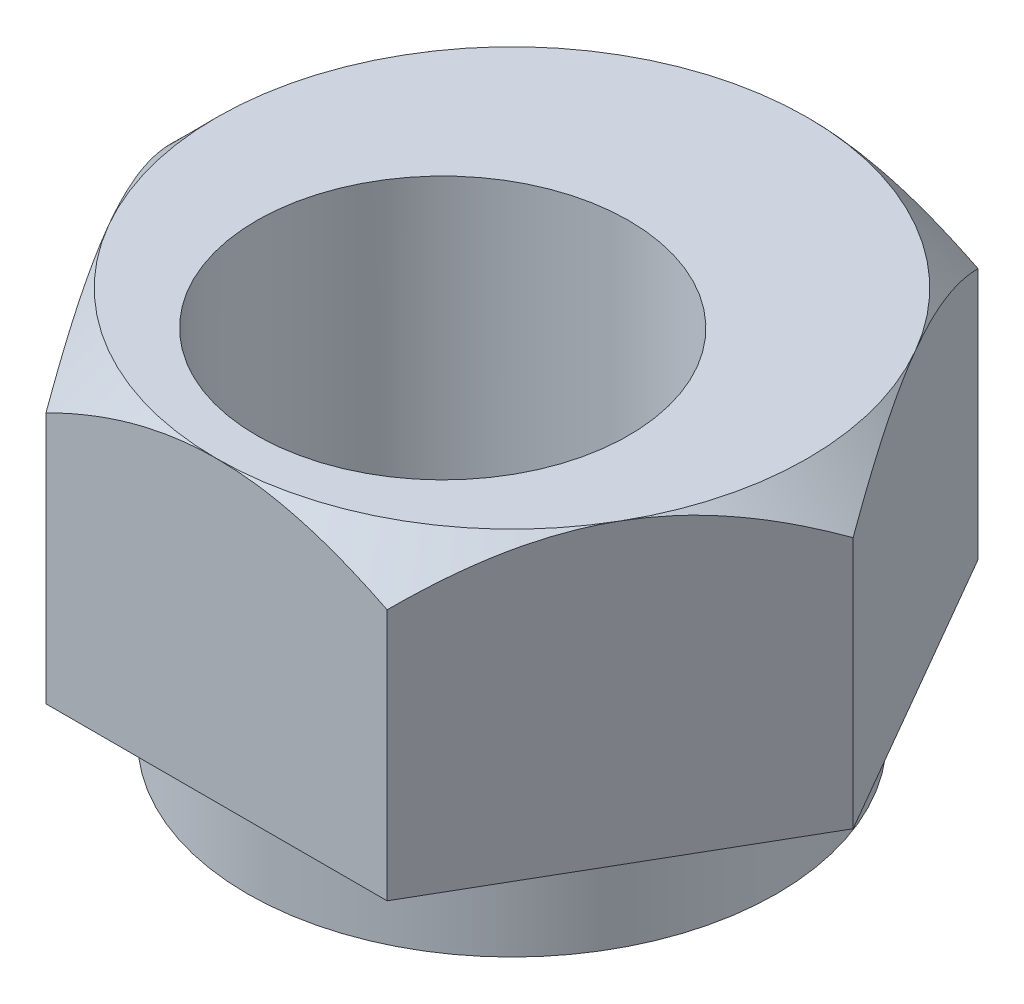
ISO-10303-21;
HEADER;
FILE_DESCRIPTION(('STEP AP214'),'2;1');
FILE_NAME('part.step','',(''),(''),'','','');
FILE_SCHEMA(('AUTOMOTIVE_DESIGN { 1 0 10303 214 1 1 1 1 }'));
ENDSEC;
DATA;
#1=APPLICATION_CONTEXT('core data for automotive mechanical design processes');
#2=APPLICATION_PROTOCOL_DEFINITION('international standard','automotive_design',2000,#1);
#3=PRODUCT_CONTEXT('',#1,'mechanical');
#4=PRODUCT('Part','Part','',(#3));
#5=PRODUCT_RELATED_PRODUCT_CATEGORY('part','',(#4));
#6=PRODUCT_DEFINITION_FORMATION('','',#4);
#7=PRODUCT_DEFINITION_CONTEXT('part definition',#1,'design');
#8=PRODUCT_DEFINITION('design','',#6,#7);
#9=PRODUCT_DEFINITION_SHAPE('','',#8);
#10=(LENGTH_UNIT() NAMED_UNIT(*) SI_UNIT(.MILLI.,.METRE.));
#11=(NAMED_UNIT(*) PLANE_ANGLE_UNIT() SI_UNIT($,.RADIAN.));
#12=(NAMED_UNIT(*) SI_UNIT($,.STERADIAN.) SOLID_ANGLE_UNIT());
#13=UNCERTAINTY_MEASURE_WITH_UNIT(LENGTH_MEASURE(1.E-05),#10,'distance_accuracy_value','');
#14=(GEOMETRIC_REPRESENTATION_CONTEXT(3) GLOBAL_UNCERTAINTY_ASSIGNED_CONTEXT((#13)) GLOBAL_UNIT_ASSIGNED_CONTEXT((#10,
#11,#12)) REPRESENTATION_CONTEXT('',''));
#15=CARTESIAN_POINT('',(0.,0.,0.));
#16=DIRECTION('',(0.,0.,1.));
#17=DIRECTION('',(1.,0.,0.));
#18=AXIS2_PLACEMENT_3D('',#15,#16,#17);
#19=CARTESIAN_POINT('',(0.,3.999999999999,0.));
#20=DIRECTION('',(0.,1.,0.));
#21=DIRECTION('',(0.,0.,1.));
#22=AXIS2_PLACEMENT_3D('',#19,#20,#21);
#23=PLANE('',#22);
#24=CARTESIAN_POINT('',(1.166697489341,3.999999999999,2.539836185835));
#25=CARTESIAN_POINT('',(0.883257962455717,3.999999999999,2.77528744265303));
#26=CARTESIAN_POINT('',(0.533594005447036,3.999999999999,2.902538680086));
#27=CARTESIAN_POINT('',(0.188940030478766,3.999999999999,3.02796666293016));
#28=CARTESIAN_POINT('',(-0.182778207629667,3.999999999999,3.03416217031467));
#29=CARTESIAN_POINT('',(-0.605155037690562,3.999999999999,3.04120201528704));
#30=CARTESIAN_POINT('',(-1.00776253572052,3.999999999999,2.89290446902202));
#31=CARTESIAN_POINT('',(-1.44869321008123,3.999999999999,2.7304908592392));
#32=CARTESIAN_POINT('',(-1.79750508633833,3.999999999999,2.40662784371367));
#33=CARTESIAN_POINT('',(-2.14544434499793,3.999999999999,2.08357503158361));
#34=CARTESIAN_POINT('',(-2.34904602147654,3.999999999999,1.64752654861127));
#35=CARTESIAN_POINT('',(-2.55612773403344,3.999999999999,1.20402496172117));
#36=CARTESIAN_POINT('',(-2.58214130883733,3.999999999999,0.7093389879597));
#37=CARTESIAN_POINT('',(-2.60843531854522,3.999999999999,0.209320136475604));
#38=CARTESIAN_POINT('',(-2.4451812772816,3.999999999999,-0.270702997808114));
#39=CARTESIAN_POINT('',(-2.28034954976724,3.999999999999,-0.75536507329745));
#40=CARTESIAN_POINT('',(-1.944203567264,3.999999999999,-1.150453567264));
#41=B_SPLINE_CURVE_WITH_KNOTS('',2,(#24,#25,#26,#27,#28,#29,#30,#31,#32,#33,#34,#35,#36,#37,#38,
#39,#40),.UNSPECIFIED.,.F.,.F.,(3,2,2,2,2,2,2,2,3),(0.,0.125,0.25,0.375,0.5,0.625,0.75,0.875,
1.),.UNSPECIFIED.);
#42=CARTESIAN_POINT('',(-2.46330983698216,4.00000005928982,1.35760135508939));
#43=VERTEX_POINT('',#42);
#44=CARTESIAN_POINT('',(-2.46395330810029,4.00001258649946,1.35447367589018));
#45=VERTEX_POINT('',#44);
#46=EDGE_CURVE('E13',#43,#45,#41,.T.);
#47=ORIENTED_EDGE('',*,*,#46,.T.);
#48=CARTESIAN_POINT('',(0.,3.999999999999,0.930865744066416));
#49=DIRECTION('',(0.,1.,0.));
#50=DIRECTION('',(0.,0.,1.));
#51=AXIS2_PLACEMENT_3D('',#48,#49,#50);
#52=CIRCLE('',#51,2.5);
#53=EDGE_CURVE('E133',#45,#43,#52,.F.);
#54=ORIENTED_EDGE('',*,*,#53,.T.);
#55=EDGE_LOOP('',(#47,#54));
#56=FACE_BOUND('',#55,.T.);
#57=CARTESIAN_POINT('',(0.,3.99999999996226,0.));
#58=DIRECTION('',(0.,-1.,0.));
#59=DIRECTION('',(0.,0.,-1.));
#60=AXIS2_PLACEMENT_3D('',#57,#58,#59);
#61=CIRCLE('',#60,3.96875000001273);
#62=CARTESIAN_POINT('',(0.,3.99999999998063,-3.96875000000637));
#63=VERTEX_POINT('',#62);
#64=CARTESIAN_POINT('',(-3.43703832127474,3.99999999998063,-1.98437500000331));
#65=VERTEX_POINT('',#64);
#66=EDGE_CURVE('E454',#63,#65,#61,.F.);
#67=ORIENTED_EDGE('',*,*,#66,.T.);
#68=CARTESIAN_POINT('',(0.,3.99999999996226,0.));
#69=DIRECTION('',(0.,-1.,0.));
#70=DIRECTION('',(0.,0.,-1.));
#71=AXIS2_PLACEMENT_3D('',#68,#69,#70);
#72=CIRCLE('',#71,3.96875000001273);
#73=CARTESIAN_POINT('',(-3.43703832127484,3.99999999998063,1.98437500000337));
#74=VERTEX_POINT('',#73);
#75=EDGE_CURVE('E458',#65,#74,#72,.F.);
#76=ORIENTED_EDGE('',*,*,#75,.T.);
#77=CARTESIAN_POINT('',(0.,3.99999999996226,0.));
#78=DIRECTION('',(0.,-1.,0.));
#79=DIRECTION('',(0.,0.,-1.));
#80=AXIS2_PLACEMENT_3D('',#77,#78,#79);
#81=CIRCLE('',#80,3.96875000001273);
#82=CARTESIAN_POINT('',(0.,3.99999999998063,3.96875000000637));
#83=VERTEX_POINT('',#82);
#84=EDGE_CURVE('E409',#74,#83,#81,.F.);
#85=ORIENTED_EDGE('',*,*,#84,.T.);
#86=CARTESIAN_POINT('',(0.,3.99999999996226,0.));
#87=DIRECTION('',(0.,-1.,0.));
#88=DIRECTION('',(0.,0.,-1.));
#89=AXIS2_PLACEMENT_3D('',#86,#87,#88);
#90=CIRCLE('',#89,3.96875000001273);
#91=CARTESIAN_POINT('',(3.43703832127474,3.99999999998063,1.98437500000331));
#92=VERTEX_POINT('',#91);
#93=EDGE_CURVE('E438',#83,#92,#90,.F.);
#94=ORIENTED_EDGE('',*,*,#93,.T.);
#95=CARTESIAN_POINT('',(0.,3.99999999996226,0.));
#96=DIRECTION('',(0.,-1.,0.));
#97=DIRECTION('',(0.,0.,-1.));
#98=AXIS2_PLACEMENT_3D('',#95,#96,#97);
#99=CIRCLE('',#98,3.96875000001273);
#100=CARTESIAN_POINT('',(3.43703832127485,3.99999999998063,-1.98437500000337));
#101=VERTEX_POINT('',#100);
#102=EDGE_CURVE('E446',#92,#101,#99,.F.);
#103=ORIENTED_EDGE('',*,*,#102,.T.);
#104=CARTESIAN_POINT('',(0.,3.99999999996226,0.));
#105=DIRECTION('',(0.,-1.,0.));
#106=DIRECTION('',(0.,0.,-1.));
#107=AXIS2_PLACEMENT_3D('',#104,#105,#106);
#108=CIRCLE('',#107,3.96875000001273);
#109=EDGE_CURVE('E450',#101,#63,#108,.F.);
#110=ORIENTED_EDGE('',*,*,#109,.T.);
#111=EDGE_LOOP('',(#67,#76,#85,#94,#103,#110));
#112=FACE_BOUND('',#111,.T.);
#113=ADVANCED_FACE('F47',(#56,#112),#23,.T.);
#114=CARTESIAN_POINT('',(-2.291358880846,0.,3.96875));
#115=DIRECTION('',(0.,0.,1.));
#116=DIRECTION('',(1.,0.,0.));
#117=AXIS2_PLACEMENT_3D('',#114,#115,#116);
#118=PLANE('',#117);
#119=CARTESIAN_POINT('',(0.,3.99999999996226,3.96875000001273));
#120=CARTESIAN_POINT('',(0.0457095987080861,4.00000206891718,3.96875024632705));
#121=CARTESIAN_POINT('',(0.0914195766281311,3.99922980150657,3.96873059956683));
#122=CARTESIAN_POINT('',(0.182607728731246,3.99613588443684,3.96867493172411));
#123=CARTESIAN_POINT('',(0.228086109535207,3.99382031594142,3.96863897508537));
#124=CARTESIAN_POINT('',(0.318915770227566,3.98764066070864,3.96857375250295));
#125=CARTESIAN_POINT('',(0.364267100423619,3.98377731366321,3.96854448337376));
#126=CARTESIAN_POINT('',(0.454946433801063,3.97450873621608,3.96850436756592));
#127=CARTESIAN_POINT('',(0.500273975977285,3.96909900384468,3.9684935753295));
#128=CARTESIAN_POINT('',(0.591008307066825,3.95674245124714,3.96849424747512));
#129=CARTESIAN_POINT('',(0.636413809102213,3.9497862007543,3.9685058519127));
#130=CARTESIAN_POINT('',(0.727404785949458,3.93434189886261,3.96854637074489));
#131=CARTESIAN_POINT('',(0.772987900522036,3.92583998045072,3.96857544783735));
#132=CARTESIAN_POINT('',(0.86443262234442,3.9073071798825,3.96864001395477));
#133=CARTESIAN_POINT('',(0.910290634556897,3.89725858490791,3.96867557827984));
#134=CARTESIAN_POINT('',(1.00238038315686,3.87564144825838,3.96872844768904));
#135=CARTESIAN_POINT('',(1.04860721027719,3.8640521311649,3.96874546711375));
#136=CARTESIAN_POINT('',(1.19343585971195,3.82552886514039,3.96875972210626));
#137=CARTESIAN_POINT('',(1.29141354418754,3.79621689094152,3.96871200437323));
#138=CARTESIAN_POINT('',(1.48816201860519,3.73130552498814,3.96864832622998));
#139=CARTESIAN_POINT('',(1.58688360281105,3.69555858888505,3.96863325187711));
#140=CARTESIAN_POINT('',(1.78579011131671,3.61783110870672,3.96864343132446));
#141=CARTESIAN_POINT('',(1.8859066942408,3.57567712733408,3.9686701045776));
#142=CARTESIAN_POINT('',(2.08819585569872,3.48512907490612,3.96872313763878));
#143=CARTESIAN_POINT('',(2.19028635609137,3.43655089902638,3.96874944054027));
#144=CARTESIAN_POINT('',(2.29135852710742,3.38603241516466,3.96874999998512));
#145=B_SPLINE_CURVE_WITH_KNOTS('',3,(#119,#120,#121,#122,#123,#124,#125,#126,#127,#128,#129,
#130,#131,#132,#133,#134,#135,#136,#137,#138,#139,#140,#141,#142,#143,#144),.UNSPECIFIED.,.F.,
.F.,(4,2,2,2,2,2,2,2,2,2,2,2,4),(0.,0.13712276859788,0.273708393404633,0.410228820902219,
0.54715081848351,0.684931820055363,0.824016102220433,0.964831459822118,1.10778649851411,
1.4143956001324,1.72922797581916,2.05499960768534,2.39402560199516),.UNSPECIFIED.);
#146=CARTESIAN_POINT('',(2.2913588100969,3.38603227367641,3.96874999999462));
#147=VERTEX_POINT('',#146);
#148=EDGE_CURVE('E415',#83,#147,#145,.T.);
#149=ORIENTED_EDGE('',*,*,#148,.F.);
#150=CARTESIAN_POINT('',(-2.29135888083906,3.38603223829637,3.96874999998799));
#151=CARTESIAN_POINT('',(-2.19030292394784,3.43654267165224,3.96874942705434));
#152=CARTESIAN_POINT('',(-2.08822869505807,3.48511279605784,3.96872391845131));
#153=CARTESIAN_POINT('',(-1.88596742688328,3.57564813811904,3.96867309720218));
#154=CARTESIAN_POINT('',(-1.78586235780583,3.61779721809174,3.96864781580555));
#155=CARTESIAN_POINT('',(-1.58697469400111,3.69551820644137,3.96864015955652));
#156=CARTESIAN_POINT('',(-1.48826033521286,3.73126328467235,3.96865637420848));
#157=CARTESIAN_POINT('',(-1.29152273209468,3.79617447952967,3.96872097918334));
#158=CARTESIAN_POINT('',(-1.19354860151577,3.82548785845909,3.96876851936701));
#159=CARTESIAN_POINT('',(-1.04871803401833,3.86401659311211,3.96875299564418));
#160=CARTESIAN_POINT('',(-1.00248556394845,3.87560898692438,3.9687354188248));
#161=CARTESIAN_POINT('',(-0.910384809893494,3.89723179354629,3.96868151488934));
#162=CARTESIAN_POINT('',(-0.8645214394671,3.90728299692585,3.96864547249274));
#163=CARTESIAN_POINT('',(-0.773066270001621,3.92582061613733,3.96857996191194));
#164=CARTESIAN_POINT('',(-0.727478069217709,3.93432475807714,3.96855041831835));
#165=CARTESIAN_POINT('',(-0.636477147793109,3.94977308750196,3.96850902499101));
#166=CARTESIAN_POINT('',(-0.591066789848118,3.9567311542831,3.96849701194752));
#167=CARTESIAN_POINT('',(-0.500322939602409,3.96909092718222,3.96849559289817));
#168=CARTESIAN_POINT('',(-0.454990735803226,3.97450207397872,3.9685060462934));
#169=CARTESIAN_POINT('',(-0.364302233464097,3.98377306867821,3.96854557062735));
#170=CARTESIAN_POINT('',(-0.318946396831242,3.98763742662774,3.96857458678932));
#171=CARTESIAN_POINT('',(-0.228107838446357,3.99381869428148,3.96863939974725));
#172=CARTESIAN_POINT('',(-0.182625066741055,3.99613486962526,3.96867519975071));
#173=CARTESIAN_POINT('',(-0.0914282081121111,3.99922959644149,3.96873065553996));
#174=CARTESIAN_POINT('',(-0.0457139146130119,4.00000206907572,3.96875024732391));
#175=CARTESIAN_POINT('',(0.,3.99999999996226,3.96875000001273));
#176=B_SPLINE_CURVE_WITH_KNOTS('',3,(#150,#151,#152,#153,#154,#155,#156,#157,#158,#159,#160,
#161,#162,#163,#164,#165,#166,#167,#168,#169,#170,#171,#172,#173,#174,#175),.UNSPECIFIED.,.F.,
.F.,(4,2,2,2,2,2,2,2,2,2,2,2,4),(0.,0.338971606306674,0.664705718801143,0.979515894783986,
1.28611611614647,1.42908981649883,1.56992254383368,1.70902304277289,1.84681926024786,
1.98375563697677,2.12028978127421,2.2568886429092,2.39402435592131),.UNSPECIFIED.);
#177=CARTESIAN_POINT('',(-2.29135891621726,3.38603227367641,3.9687499387262));
#178=VERTEX_POINT('',#177);
#179=EDGE_CURVE('E399',#178,#83,#176,.T.);
#180=ORIENTED_EDGE('',*,*,#179,.F.);
#181=DIRECTION('',(0.,1.,0.));
#182=VECTOR('',#181,1.);
#183=CARTESIAN_POINT('',(-2.29135888084643,0.,3.96875000000025));
#184=LINE('',#183,#182);
#185=CARTESIAN_POINT('',(-2.29135888084643,0.,3.96875000000025));
#186=VERTEX_POINT('',#185);
#187=EDGE_CURVE('E147',#186,#178,#184,.T.);
#188=ORIENTED_EDGE('',*,*,#187,.F.);
#189=DIRECTION('',(1.,0.,0.));
#190=VECTOR('',#189,1.);
#191=CARTESIAN_POINT('',(0.,0.,3.96875));
#192=LINE('',#191,#190);
#193=CARTESIAN_POINT('',(2.291358880846,0.,3.96875));
#194=VERTEX_POINT('',#193);
#195=EDGE_CURVE('E141',#186,#194,#192,.T.);
#196=ORIENTED_EDGE('',*,*,#195,.T.);
#197=DIRECTION('',(0.,1.,0.));
#198=VECTOR('',#197,1.);
#199=CARTESIAN_POINT('',(2.291358880846,0.,3.96875));
#200=LINE('',#199,#198);
#201=EDGE_CURVE('E121',#147,#194,#200,.F.);
#202=ORIENTED_EDGE('',*,*,#201,.F.);
#203=EDGE_LOOP('',(#149,#180,#188,#196,#202));
#204=FACE_BOUND('',#203,.T.);
#205=ADVANCED_FACE('F49',(#204),#118,.T.);
#206=CARTESIAN_POINT('',(2.291358880846,0.,3.96875));
#207=DIRECTION('',(0.866025403784429,0.,0.500000000000017));
#208=DIRECTION('',(0.500000000000017,0.,-0.866025403784429));
#209=AXIS2_PLACEMENT_3D('',#206,#207,#208);
#210=PLANE('',#209);
#211=CARTESIAN_POINT('',(3.4370383212804,3.99999999996226,1.98437500000658));
#212=CARTESIAN_POINT('',(3.4598933339274,4.00000206891719,1.94478944952295));
#213=CARTESIAN_POINT('',(3.48273130827393,3.99922980150637,1.90519362409577));
#214=CARTESIAN_POINT('',(3.52827717452745,3.99613588443664,1.82619453399554));
#215=CARTESIAN_POINT('',(3.55098522555478,3.99382031594101,1.78679112260545));
#216=CARTESIAN_POINT('',(3.59634357147046,3.98764066070823,1.70809771778428));
#217=CARTESIAN_POINT('',(3.61899388875388,3.98377731366259,1.66880767919276));
#218=CARTESIAN_POINT('',(3.66429881412932,3.97450873621547,1.59025701501137));
#219=CARTESIAN_POINT('',(3.6869532388671,3.96909900384388,1.55099681588484));
#220=CARTESIAN_POINT('',(3.73232098651294,3.95674245124632,1.47241891624202));
#221=CARTESIAN_POINT('',(3.75503378727366,3.94978620075327,1.43310240022251));
#222=CARTESIAN_POINT('',(3.80056436604937,3.93434189886166,1.35432216215332));
#223=CARTESIAN_POINT('',(3.82338110484514,3.92583998044972,1.31486056547977));
#224=CARTESIAN_POINT('',(3.86915938167473,3.90730717988121,1.2356993963533));
#225=CARTESIAN_POINT('',(3.89211918740164,3.89725858490604,1.19600297494412));
#226=CARTESIAN_POINT('',(3.93820984797616,3.87564144825772,1.11627734786066));
#227=CARTESIAN_POINT('',(3.96133800080177,3.86405213116578,1.07625225090672));
#228=CARTESIAN_POINT('',(4.03376467065962,3.82552886518264,0.950834088805857));
#229=CARTESIAN_POINT('',(4.08271218807613,3.79621689102505,0.865959066233572));
#230=CARTESIAN_POINT('',(4.18103127833296,3.73130552512655,0.695538050240337));
#231=CARTESIAN_POINT('',(4.23037901565338,3.69555858903382,0.610035113266867));
#232=CARTESIAN_POINT('',(4.32984108557728,3.61783110885419,0.437782113658191));
#233=CARTESIAN_POINT('',(4.37992247677481,3.57567712746703,0.351091946118043));
#234=CARTESIAN_POINT('',(4.48111298554821,3.48512907498574,0.175930909836353));
#235=CARTESIAN_POINT('',(4.53218101477027,3.43655089906465,0.0875310943977859));
#236=CARTESIAN_POINT('',(4.58271758481031,3.38603241516466,3.06335579584753E-07));
#237=B_SPLINE_CURVE_WITH_KNOTS('',3,(#211,#212,#213,#214,#215,#216,#217,#218,#219,#220,#221,
#222,#223,#224,#225,#226,#227,#228,#229,#230,#231,#232,#233,#234,#235,#236),.UNSPECIFIED.,.F.,
.F.,(4,2,2,2,2,2,2,2,2,2,2,2,4),(0.,0.137122768468879,0.273708393183656,0.410228820626262,
0.547150818189421,0.684931819779717,0.824016101999417,0.964831459691449,1.10778649850897,
1.4143955998813,1.72922797547654,2.05499960742266,2.3940256019968),.UNSPECIFIED.);
#238=CARTESIAN_POINT('',(4.5827177263135,3.38603227367641,6.12670662477371E-08));
#239=VERTEX_POINT('',#238);
#240=EDGE_CURVE('E332',#92,#239,#237,.T.);
#241=ORIENTED_EDGE('',*,*,#240,.F.);
#242=CARTESIAN_POINT('',(2.29135888083907,3.38603223829637,3.96874999998799));
#243=CARTESIAN_POINT('',(2.34188636315842,3.43654267166193,3.88123268760993));
#244=CARTESIAN_POINT('',(2.39290138654287,3.48511279608248,3.79282105797528));
#245=CARTESIAN_POINT('',(2.49398800818157,3.57564813816269,3.61763225084975));
#246=CARTESIAN_POINT('',(2.54401864839507,3.61779721814078,3.53092607726646));
#247=CARTESIAN_POINT('',(2.64345584978097,3.69551820649039,3.35868047978388));
#248=CARTESIAN_POINT('',(2.69282707145864,3.73126328471762,3.27319944469405));
#249=CARTESIAN_POINT('',(2.79125182251763,3.79617447955675,3.10285198505887));
#250=CARTESIAN_POINT('',(2.84028005878089,3.82548785847367,3.0180276692005));
#251=CARTESIAN_POINT('',(2.91268189854174,3.86401659310027,2.89259295672768));
#252=CARTESIAN_POINT('',(2.93578291158353,3.87560898690079,2.85254567479697));
#253=CARTESIAN_POINT('',(2.98178660640029,3.8972317935027,2.77275713017807));
#254=CARTESIAN_POINT('',(3.00468707797022,3.90728299687362,2.73302026511617));
#255=CARTESIAN_POINT('',(3.05035792885858,3.92582061607165,2.65378500980813));
#256=CARTESIAN_POINT('',(3.07312644374301,3.93432475800623,2.61428969803761));
#257=CARTESIAN_POINT('',(3.11859105677831,3.94977308742433,2.53545989167723));
#258=CARTESIAN_POINT('',(3.141285832151,3.95673115420356,2.49612736158692));
#259=CARTESIAN_POINT('',(3.18665652834778,3.96909092710266,2.41754017251422));
#260=CARTESIAN_POINT('',(3.20933168315893,3.97450207390062,2.37828655910738));
#261=CARTESIAN_POINT('',(3.25471016342064,3.98377306860679,2.29976777439597));
#262=CARTESIAN_POINT('',(3.27741321047963,3.98763742656113,2.26050297572627));
#263=CARTESIAN_POINT('',(3.32288861936065,3.99381869422827,2.18186688295507));
#264=CARTESIAN_POINT('',(3.34566100893711,3.99613486958024,2.14249554719651));
#265=CARTESIAN_POINT('',(3.39130746439759,3.99922959641656,2.06354447870265));
#266=CARTESIAN_POINT('',(3.41418157814208,4.00000206906233,2.02396453506681));
#267=CARTESIAN_POINT('',(3.4370383212804,3.99999999996226,1.98437500000658));
#268=B_SPLINE_CURVE_WITH_KNOTS('',3,(#242,#243,#244,#245,#246,#247,#248,#249,#250,#251,#252,
#253,#254,#255,#256,#257,#258,#259,#260,#261,#262,#263,#264,#265,#266,#267),.UNSPECIFIED.,.F.,
.F.,(4,2,2,2,2,2,2,2,2,2,2,2,4),(0.,0.338971606477896,0.664705719026994,0.979515894950275,
1.28611611614296,1.42908981635731,1.56992254359557,1.7090230424787,1.84681925993704,
1.98375563668752,2.12028978104333,2.25688864277188,2.39402435591104),.UNSPECIFIED.);
#269=EDGE_CURVE('E127',#147,#92,#268,.T.);
#270=ORIENTED_EDGE('',*,*,#269,.F.);
#271=ORIENTED_EDGE('',*,*,#201,.T.);
#272=DIRECTION('',(0.50000000000011,0.,-0.866025403784375));
#273=VECTOR('',#272,1.);
#274=CARTESIAN_POINT('',(2.291358880846,0.,3.96875));
#275=LINE('',#274,#273);
#276=CARTESIAN_POINT('',(4.58271776169295,0.,0.));
#277=VERTEX_POINT('',#276);
#278=EDGE_CURVE('E126',#194,#277,#275,.T.);
#279=ORIENTED_EDGE('',*,*,#278,.T.);
#280=DIRECTION('',(0.,1.,0.));
#281=VECTOR('',#280,1.);
#282=CARTESIAN_POINT('',(4.582717761693,0.,0.));
#283=LINE('',#282,#281);
#284=EDGE_CURVE('E132',#239,#277,#283,.F.);
#285=ORIENTED_EDGE('',*,*,#284,.F.);
#286=EDGE_LOOP('',(#241,#270,#271,#279,#285));
#287=FACE_BOUND('',#286,.T.);
#288=ADVANCED_FACE('F124',(#287),#210,.T.);
#289=CARTESIAN_POINT('',(4.582717761693,0.,0.));
#290=DIRECTION('',(0.866025403784429,0.,-0.500000000000017));
#291=DIRECTION('',(-0.500000000000017,0.,-0.866025403784429));
#292=AXIS2_PLACEMENT_3D('',#289,#290,#291);
#293=PLANE('',#292);
#294=CARTESIAN_POINT('',(3.4370383212804,3.99999999996226,-1.98437500000658));
#295=CARTESIAN_POINT('',(3.41418373519871,4.00000206891716,-2.0239607969147));
#296=CARTESIAN_POINT('',(3.39131173160018,3.99922980150696,-2.06353697569114));
#297=CARTESIAN_POINT('',(3.34566944570104,3.99613588443724,-2.14248039813496));
#298=CARTESIAN_POINT('',(3.32289911589992,3.99382031594222,-2.1818478529632));
#299=CARTESIAN_POINT('',(3.27742780107802,3.98764066070944,-2.26047603532375));
#300=CARTESIAN_POINT('',(3.25472678814463,3.98377731366443,-2.29973680483107));
#301=CARTESIAN_POINT('',(3.20935238010822,3.97450873621728,-2.37824735326317));
#302=CARTESIAN_POINT('',(3.1866792626561,3.96909900384626,-2.41749676016695));
#303=CARTESIAN_POINT('',(3.14131267919517,3.95674245124874,-2.49607533195191));
#304=CARTESIAN_POINT('',(3.11861997791694,3.94978620075634,-2.53540345239198));
#305=CARTESIAN_POINT('',(3.07315957985221,3.93434189886445,-2.61422420922902));
#306=CARTESIAN_POINT('',(3.0503932040858,3.92583998045266,-2.65371488294788));
#307=CARTESIAN_POINT('',(3.00472675912883,3.90730717988506,-2.73294061806785));
#308=CARTESIAN_POINT('',(2.98182855266875,3.89725858491164,-2.77267260372551));
#309=CARTESIAN_POINT('',(2.93582946472058,3.87564144825963,-2.85245110003565));
#310=CARTESIAN_POINT('',(2.9127307904779,3.86405213116299,-2.89249321630858));
#311=CARTESIAN_POINT('',(2.84032881096304,3.82552886505192,-3.01792563351618));
#312=CARTESIAN_POINT('',(2.7912986439027,3.79621689076642,-3.10275293856991));
#313=CARTESIAN_POINT('',(2.69286925970959,3.73130552469745,-3.27311027670774));
#314=CARTESIAN_POINT('',(2.64349541279079,3.69555858857259,-3.35859813940437));
#315=CARTESIAN_POINT('',(2.54405097416281,3.6178311083969,-3.53086131846319));
#316=CARTESIAN_POINT('',(2.49401578242223,3.57567712705495,-3.61757815918634));
#317=CARTESIAN_POINT('',(2.39291712975911,3.48512907473952,-3.79279222823489));
#318=CARTESIAN_POINT('',(2.3418946586239,3.43655089894712,-3.88121834635407));
#319=CARTESIAN_POINT('',(2.29135905770839,3.38603241516466,-3.96874969364251));
#320=B_SPLINE_CURVE_WITH_KNOTS('',3,(#294,#295,#296,#297,#298,#299,#300,#301,#302,#303,#304,
#305,#306,#307,#308,#309,#310,#311,#312,#313,#314,#315,#316,#317,#318,#319),.UNSPECIFIED.,.F.,
.F.,(4,2,2,2,2,2,2,2,2,2,2,2,4),(0.,0.137122768850756,0.27370839383781,0.410228821443157,
0.547150819059962,0.684931820595623,0.824016102653553,0.964831460078079,1.10778649852393,
1.41439560069443,1.72922797658547,2.05499960827286,2.39402560199451),.UNSPECIFIED.);
#321=CARTESIAN_POINT('',(2.29135891621718,3.38603227367641,-3.96874993872615));
#322=VERTEX_POINT('',#321);
#323=EDGE_CURVE('E430',#101,#322,#320,.T.);
#324=ORIENTED_EDGE('',*,*,#323,.F.);
#325=CARTESIAN_POINT('',(4.58271776167862,3.38603223829637,0.));
#326=CARTESIAN_POINT('',(4.53218955365519,3.43654240756444,-0.0875162786730914));
#327=CARTESIAN_POINT('',(4.481130655843,3.4851122480525,-0.175901970462465));
#328=CARTESIAN_POINT('',(4.3799564627611,3.5756472237991,-0.351039426540792));
#329=CARTESIAN_POINT('',(4.32988217491744,3.61779620415184,-0.437720224333049));
#330=CARTESIAN_POINT('',(4.23043178737759,3.69551718348254,-0.609958247271571));
#331=CARTESIAN_POINT('',(4.18108858158488,3.73126233289425,-0.695455680598951));
#332=CARTESIAN_POINT('',(4.08277530312923,3.79617390488362,-0.865868282979057));
#333=CARTESIAN_POINT('',(4.03382905128222,3.82548756773345,-0.950740501675081));
#334=CARTESIAN_POINT('',(3.96140001649954,3.8640165870481,-1.07615974039247));
#335=CARTESIAN_POINT('',(3.93826863839335,3.87560899154645,-1.11618914057494));
#336=CARTESIAN_POINT('',(3.89217174054711,3.89723180658882,-1.19592327668603));
#337=CARTESIAN_POINT('',(3.86920892323198,3.90728300591656,-1.23562389962244));
#338=CARTESIAN_POINT('',(3.82342474770995,3.92582062303388,-1.31479333091935));
#339=CARTESIAN_POINT('',(3.80060512283109,3.93432476459565,-1.35425898564555));
#340=CARTESIAN_POINT('',(3.75506891261368,3.94977309465656,-1.43304725702775));
#341=CARTESIAN_POINT('',(3.73235336682873,3.95673115992868,-1.47236774615492));
#342=CARTESIAN_POINT('',(3.68698025363411,3.96909093271629,-1.55095354011475));
#343=CARTESIAN_POINT('',(3.6643232084988,3.97450207817508,-1.59021765908127));
#344=CARTESIAN_POINT('',(3.6190131539638,3.9837730729381,-1.66877614812597));
#345=CARTESIAN_POINT('',(3.59636032795453,3.98763742941929,-1.70807009106096));
#346=CARTESIAN_POINT('',(3.55099705763398,3.99381869709639,-1.78677132420642));
#347=CARTESIAN_POINT('',(3.52828659103281,3.99613487099811,-1.82617865945905));
#348=CARTESIAN_POINT('',(3.48273596325851,3.99922959781931,-1.90518564982997));
#349=CARTESIAN_POINT('',(3.45989564324459,4.00000206899453,-1.94478545188732));
#350=CARTESIAN_POINT('',(3.4370383212804,3.99999999996226,-1.98437500000658));
#351=B_SPLINE_CURVE_WITH_KNOTS('',3,(#325,#326,#327,#328,#329,#330,#331,#332,#333,#334,#335,
#336,#337,#338,#339,#340,#341,#342,#343,#344,#345,#346,#347,#348,#349,#350),.UNSPECIFIED.,.F.,
.F.,(4,2,2,2,2,2,2,2,2,2,2,2,4),(0.,0.338969819182791,0.66470339426338,0.979514193333062,
1.28611608058893,1.42908890511539,1.56992100250054,1.70902112106712,1.84681721105027,
1.98375371586579,2.12028824575226,2.25688775152184,2.39402436734404),.UNSPECIFIED.);
#352=EDGE_CURVE('E321',#239,#101,#351,.T.);
#353=ORIENTED_EDGE('',*,*,#352,.F.);
#354=ORIENTED_EDGE('',*,*,#284,.T.);
#355=DIRECTION('',(-0.50000000000011,0.,-0.866025403784375));
#356=VECTOR('',#355,1.);
#357=CARTESIAN_POINT('',(4.582717761693,0.,0.));
#358=LINE('',#357,#356);
#359=CARTESIAN_POINT('',(2.29135888084611,0.,-3.96875));
#360=VERTEX_POINT('',#359);
#361=EDGE_CURVE('E144',#277,#360,#358,.T.);
#362=ORIENTED_EDGE('',*,*,#361,.T.);
#363=DIRECTION('',(0.,1.,0.));
#364=VECTOR('',#363,1.);
#365=CARTESIAN_POINT('',(2.291358880846,0.,-3.96875));
#366=LINE('',#365,#364);
#367=EDGE_CURVE('E265',#322,#360,#366,.F.);
#368=ORIENTED_EDGE('',*,*,#367,.F.);
#369=EDGE_LOOP('',(#324,#353,#354,#362,#368));
#370=FACE_BOUND('',#369,.T.);
#371=ADVANCED_FACE('F257',(#370),#293,.T.);
#372=CARTESIAN_POINT('',(2.291358880846,0.,-3.96875));
#373=DIRECTION('',(0.,0.,-1.));
#374=DIRECTION('',(-1.,0.,0.));
#375=AXIS2_PLACEMENT_3D('',#372,#373,#374);
#376=PLANE('',#375);
#377=CARTESIAN_POINT('',(0.,3.99999999996226,-3.96875000001273));
#378=CARTESIAN_POINT('',(-0.0457068348680366,4.00000295964052,-3.96874935598807));
#379=CARTESIAN_POINT('',(-0.0914140612603135,3.99923145995917,-3.9687290366179));
#380=CARTESIAN_POINT('',(-0.182597452553986,3.99613887931449,-3.96867238370944));
#381=CARTESIAN_POINT('',(-0.228073823192992,3.99382385587281,-3.96863611296064));
#382=CARTESIAN_POINT('',(-0.318900228437797,3.98764509201685,-3.96857054224155));
#383=CARTESIAN_POINT('',(-0.364250311580335,3.98378206532774,-3.9685412390687));
#384=CARTESIAN_POINT('',(-0.454927939963535,3.97451393272245,-3.96850125245096));
#385=CARTESIAN_POINT('',(-0.500255021399394,3.96910429738598,-3.96849062436129));
#386=CARTESIAN_POINT('',(-0.590989243370329,3.95674774314039,-3.96849174062158));
#387=CARTESIAN_POINT('',(-0.636395093179358,3.94979136583016,-3.96850362615933));
#388=CARTESIAN_POINT('',(-0.727387601949078,3.93434661817943,-3.96854473587644));
#389=CARTESIAN_POINT('',(-0.772971895879637,3.92584435289039,-3.96857412331919));
#390=CARTESIAN_POINT('',(-0.864419832108804,3.9073106537107,-3.96863926727986));
#391=CARTESIAN_POINT('',(-0.910279873787598,3.89726147981141,-3.96867509862208));
#392=CARTESIAN_POINT('',(-1.00237457065744,3.87564302585176,-3.96872832053727));
#393=CARTESIAN_POINT('',(-1.04860431066979,3.86405294551013,-3.96874542226789));
#394=CARTESIAN_POINT('',(-1.19343583676091,3.8255287788683,-3.96875981767147));
#395=CARTESIAN_POINT('',(-1.29141353796541,3.79621686737533,-3.96871203046358));
#396=CARTESIAN_POINT('',(-1.48816202512221,3.73130554911005,-3.96864829947595));
#397=CARTESIAN_POINT('',(-1.58688360477138,3.69555859586031,-3.96863324411291));
#398=CARTESIAN_POINT('',(-1.78579010947095,3.61783110138655,-3.96864343939228));
#399=CARTESIAN_POINT('',(-1.88590669333654,3.57567712358135,-3.96867010869515));
#400=CARTESIAN_POINT('',(-2.08819585677643,3.48512907873729,-3.96872313336836));
#401=CARTESIAN_POINT('',(-2.19028635821313,3.43655090688687,-3.96874943181887));
#402=CARTESIAN_POINT('',(-2.29135852710637,3.38603241516466,-3.96874999998572));
#403=B_SPLINE_CURVE_WITH_KNOTS('',3,(#377,#378,#379,#380,#381,#382,#383,#384,#385,#386,#387,
#388,#389,#390,#391,#392,#393,#394,#395,#396,#397,#398,#399,#400,#401,#402),.UNSPECIFIED.,.F.,
.F.,(4,2,2,2,2,2,2,2,2,2,2,2,4),(0.,0.137114471378774,0.273693983000428,0.41021059534592,
0.547131181130379,0.684913269035933,0.824001218889362,0.964822897069948,1.10778696971739,
1.41439607141615,1.72922844713302,2.05500007897309,2.39402607319613),.UNSPECIFIED.);
#404=CARTESIAN_POINT('',(-2.29135881009669,3.38603227367641,-3.96874999999474));
#405=VERTEX_POINT('',#404);
#406=EDGE_CURVE('E240',#63,#405,#403,.T.);
#407=ORIENTED_EDGE('',*,*,#406,.F.);
#408=CARTESIAN_POINT('',(2.29135888083907,3.38603223829637,-3.96874999998799));
#409=CARTESIAN_POINT('',(2.1903029259847,3.43654267953589,-3.96874941835459));
#410=CARTESIAN_POINT('',(2.08822869596777,3.48511279994298,-3.9687239142099));
#411=CARTESIAN_POINT('',(1.88596742570159,3.5756481344596,-3.96867310134903));
#412=CARTESIAN_POINT('',(1.7858623556573,3.61779721087562,-3.96864782389616));
#413=CARTESIAN_POINT('',(1.58697469566288,3.69551821352107,-3.96864015179857));
#414=CARTESIAN_POINT('',(1.48826034146215,3.73126330889193,-3.96865634744979));
#415=CARTESIAN_POINT('',(1.29152272571091,3.7961744560198,-3.96872100526555));
#416=CARTESIAN_POINT('',(1.19354857847867,3.82548777220868,-3.96876861493468));
#417=CARTESIAN_POINT('',(1.04871513354836,3.8640174077941,-3.96875295076424));
#418=CARTESIAN_POINT('',(1.0024797497214,3.87561056518929,-3.96873529157103));
#419=CARTESIAN_POINT('',(0.910374045937893,3.89723468969196,-3.96868103493324));
#420=CARTESIAN_POINT('',(0.864508645454893,3.90728647224244,-3.96864472539227));
#421=CARTESIAN_POINT('',(0.773050260657146,3.92582499045016,-3.96857863670238));
#422=CARTESIAN_POINT('',(0.727460880183101,3.93432947941639,-3.96854878262038));
#423=CARTESIAN_POINT('',(0.636458426415716,3.94977825479209,-3.96850679815461));
#424=CARTESIAN_POINT('',(0.591047720611777,3.95673644844533,-3.96849450389428));
#425=CARTESIAN_POINT('',(0.500303979545503,3.9690962229935,-3.96849264055526));
#426=CARTESIAN_POINT('',(0.454972236635173,3.97450727271403,-3.96850292974319));
#427=CARTESIAN_POINT('',(0.364285439806994,3.9837778223811,-3.96854232485635));
#428=CARTESIAN_POINT('',(0.318930850597605,3.98764185983747,-3.96857137508915));
#429=CARTESIAN_POINT('',(0.228095548608021,3.99382223573204,-3.96863653635937));
#430=CARTESIAN_POINT('',(0.18261478764654,3.9961378657886,-3.96867265061876));
#431=CARTESIAN_POINT('',(0.0914226911823335,3.99923125560642,-3.96872909191486));
#432=CARTESIAN_POINT('',(0.0457111499879192,4.00000296018215,-3.9687493566021));
#433=CARTESIAN_POINT('',(0.,3.99999999996226,-3.96875000001273));
#434=B_SPLINE_CURVE_WITH_KNOTS('',3,(#408,#409,#410,#411,#412,#413,#414,#415,#416,#417,#418,
#419,#420,#421,#422,#423,#424,#425,#426,#427,#428,#429,#430,#431,#432,#433),.UNSPECIFIED.,.F.,
.F.,(4,2,2,2,2,2,2,2,2,2,2,2,4),(0.,0.338971606483898,0.664705719034712,0.979515894955886,
1.28611611614322,1.4290988532188,1.56993790304143,1.70904207074948,1.84683937484707,
1.98377433932063,2.12030466731205,2.25689741397217,2.39402482740564),.UNSPECIFIED.);
#435=EDGE_CURVE('E286',#322,#63,#434,.T.);
#436=ORIENTED_EDGE('',*,*,#435,.F.);
#437=ORIENTED_EDGE('',*,*,#367,.T.);
#438=DIRECTION('',(1.,0.,0.));
#439=VECTOR('',#438,1.);
#440=CARTESIAN_POINT('',(0.,0.,-3.96875));
#441=LINE('',#440,#439);
#442=CARTESIAN_POINT('',(-2.291358880846,0.,-3.96875));
#443=VERTEX_POINT('',#442);
#444=EDGE_CURVE('E465',#360,#443,#441,.F.);
#445=ORIENTED_EDGE('',*,*,#444,.T.);
#446=DIRECTION('',(0.,1.,0.));
#447=VECTOR('',#446,1.);
#448=CARTESIAN_POINT('',(-2.291358880846,0.,-3.96875));
#449=LINE('',#448,#447);
#450=EDGE_CURVE('E185',#405,#443,#449,.F.);
#451=ORIENTED_EDGE('',*,*,#450,.F.);
#452=EDGE_LOOP('',(#407,#436,#437,#445,#451));
#453=FACE_BOUND('',#452,.T.);
#454=ADVANCED_FACE('F246',(#453),#376,.T.);
#455=CARTESIAN_POINT('',(-2.291358880846,0.,-3.96875));
#456=DIRECTION('',(-0.866025403784429,0.,-0.500000000000017));
#457=DIRECTION('',(-0.500000000000017,0.,0.866025403784429));
#458=AXIS2_PLACEMENT_3D('',#455,#456,#457);
#459=PLANE('',#458);
#460=CARTESIAN_POINT('',(-3.4370383212804,3.99999999996226,-1.98437500000658));
#461=CARTESIAN_POINT('',(-3.45989340033046,4.00000206885549,-1.94478933465691));
#462=CARTESIAN_POINT('',(-3.48273143658076,3.9992298020447,-1.90519339161623));
#463=CARTESIAN_POINT('',(-3.52827740197041,3.99613588489631,-1.82619409592558));
#464=CARTESIAN_POINT('',(-3.55098549028573,3.99382031700356,-1.78679059654082));
#465=CARTESIAN_POINT('',(-3.59634388950225,3.98764066174937,-1.70809704726291));
#466=CARTESIAN_POINT('',(-3.61899422283876,3.98377731537332,-1.66880695213107));
#467=CARTESIAN_POINT('',(-3.66429916263552,3.97450873777307,-1.59025620862838));
#468=CARTESIAN_POINT('',(-3.68695358579714,3.96909900584397,-1.55099598660292));
#469=CARTESIAN_POINT('',(-3.73232131509516,3.95674245368669,-1.47241807608791));
#470=CARTESIAN_POINT('',(-3.75503409917511,3.94978620440227,-1.43310157195575));
#471=CARTESIAN_POINT('',(-3.80056463586277,3.934341900776,-1.35432139754458));
#472=CARTESIAN_POINT('',(-3.82338134943188,3.92583998050976,-1.31485985253714));
#473=CARTESIAN_POINT('',(-3.86915955845362,3.90730718649554,-1.23569881722751));
#474=CARTESIAN_POINT('',(-3.89211932171589,3.89725860108012,-1.19600247776239));
#475=CARTESIAN_POINT('',(-3.93820992883568,3.87564143950149,-1.11627709019014));
#476=CARTESIAN_POINT('',(-3.96133807154919,3.86405208814726,-1.07625215128668));
#477=CARTESIAN_POINT('',(-4.03376749157022,3.82552737631597,-0.950829154861196));
#478=CARTESIAN_POINT('',(-4.08271749694832,3.79621390310387,-0.865949009203742));
#479=CARTESIAN_POINT('',(-4.18103935502596,3.73130044260455,-0.695520728517624));
#480=CARTESIAN_POINT('',(-4.2303873965562,3.69555311907094,-0.610015583104667));
#481=CARTESIAN_POINT('',(-4.32984857255582,3.61782566440697,-0.43776182998123));
#482=CARTESIAN_POINT('',(-4.37992881532038,3.57567226830544,-0.351073066960829));
#483=CARTESIAN_POINT('',(-4.48111612183377,3.4851263020274,-0.175919016780982));
#484=CARTESIAN_POINT('',(-4.5321821739753,3.43654976634404,-0.0875247571928528));
#485=CARTESIAN_POINT('',(-4.58271758481031,3.38603241516466,-3.06314411579912E-07));
#486=B_SPLINE_CURVE_WITH_KNOTS('',3,(#460,#461,#462,#463,#464,#465,#466,#467,#468,#469,#470,
#471,#472,#473,#474,#475,#476,#477,#478,#479,#480,#481,#482,#483,#484,#485),.UNSPECIFIED.,.F.,
.F.,(4,2,2,2,2,2,2,2,2,2,2,2,4),(0.,0.137123166719513,0.273709075586059,0.410229673133561,
0.547151727209441,0.684932672563518,0.824016786982716,0.964831866762244,1.10778651918312,
1.41441324354857,1.72925182791639,2.05501779034949,2.39402594232316),.UNSPECIFIED.);
#487=CARTESIAN_POINT('',(-4.5827177263135,3.38603227367641,-6.12628325345247E-08));
#488=VERTEX_POINT('',#487);
#489=EDGE_CURVE('E432',#65,#488,#486,.T.);
#490=ORIENTED_EDGE('',*,*,#489,.F.);
#491=CARTESIAN_POINT('',(-2.29135888083907,3.38603223829637,-3.96874999998799));
#492=CARTESIAN_POINT('',(-2.3418863631591,3.4365426716626,-3.88123268760876));
#493=CARTESIAN_POINT('',(-2.3929013865441,3.48511279608387,-3.79282105797289));
#494=CARTESIAN_POINT('',(-2.49398800818339,3.57564813816502,-3.61763225084568));
#495=CARTESIAN_POINT('',(-2.54401864839691,3.61779721814336,-3.53092607726196));
#496=CARTESIAN_POINT('',(-2.64345584978254,3.69551820649299,-3.35868047977932));
#497=CARTESIAN_POINT('',(-2.69282707145989,3.73126328472004,-3.27319944468988));
#498=CARTESIAN_POINT('',(-2.79125182251825,3.79617447955821,-3.10285198505631));
#499=CARTESIAN_POINT('',(-2.84028005878116,3.82548785847441,-3.01802766919919));
#500=CARTESIAN_POINT('',(-2.91268189854229,3.86401659310028,-2.89259295672711));
#501=CARTESIAN_POINT('',(-2.93578291158465,3.87560898690078,-2.85254567479584));
#502=CARTESIAN_POINT('',(-2.98178660640232,3.89723179350267,-2.77275713017595));
#503=CARTESIAN_POINT('',(-3.00468707797258,3.9072829968736,-2.73302026511361));
#504=CARTESIAN_POINT('',(-3.05035792886145,3.92582061607163,-2.65378500980486));
#505=CARTESIAN_POINT('',(-3.07312644374605,3.93432475800621,-2.61428969803406));
#506=CARTESIAN_POINT('',(-3.11859105678154,3.94977308742431,-2.53545989167328));
#507=CARTESIAN_POINT('',(-3.14128583215425,3.95673115420354,-2.49612736158286));
#508=CARTESIAN_POINT('',(-3.18665652835093,3.96909092710264,-2.4175401725101));
#509=CARTESIAN_POINT('',(-3.20933168316196,3.97450207390061,-2.37828655910332));
#510=CARTESIAN_POINT('',(-3.25471016342331,3.98377306860678,-2.29976777439221));
#511=CARTESIAN_POINT('',(-3.27741321048206,3.98763742656112,-2.26050297572275));
#512=CARTESIAN_POINT('',(-3.32288861936251,3.99381869422826,-2.18186688295223));
#513=CARTESIAN_POINT('',(-3.34566100893865,3.99613486958024,-2.14249554719411));
#514=CARTESIAN_POINT('',(-3.39130746439838,3.99922959641656,-2.06354447870134));
#515=CARTESIAN_POINT('',(-3.41418157814246,4.00000206906233,-2.02396453506615));
#516=CARTESIAN_POINT('',(-3.4370383212804,3.99999999996226,-1.98437500000658));
#517=B_SPLINE_CURVE_WITH_KNOTS('',3,(#491,#492,#493,#494,#495,#496,#497,#498,#499,#500,#501,
#502,#503,#504,#505,#506,#507,#508,#509,#510,#511,#512,#513,#514,#515,#516),.UNSPECIFIED.,.F.,
.F.,(4,2,2,2,2,2,2,2,2,2,2,2,4),(0.,0.338971606482442,0.664705719032907,0.979515894954607,
1.28611611614306,1.42908981635963,1.5699225435995,1.70902304248359,1.84681925994226,
1.98375563669241,2.12028978104723,2.25688864277415,2.39402435591101),.UNSPECIFIED.);
#518=EDGE_CURVE('E66',#405,#65,#517,.T.);
#519=ORIENTED_EDGE('',*,*,#518,.F.);
#520=ORIENTED_EDGE('',*,*,#450,.T.);
#521=DIRECTION('',(-0.50000000000011,0.,0.866025403784375));
#522=VECTOR('',#521,1.);
#523=CARTESIAN_POINT('',(-2.291358880846,0.,-3.96875));
#524=LINE('',#523,#522);
#525=CARTESIAN_POINT('',(-4.58271776169297,0.,0.));
#526=VERTEX_POINT('',#525);
#527=EDGE_CURVE('E413',#443,#526,#524,.T.);
#528=ORIENTED_EDGE('',*,*,#527,.T.);
#529=DIRECTION('',(0.,1.,0.));
#530=VECTOR('',#529,1.);
#531=CARTESIAN_POINT('',(-4.582717761693,0.,0.));
#532=LINE('',#531,#530);
#533=EDGE_CURVE('E182',#488,#526,#532,.F.);
#534=ORIENTED_EDGE('',*,*,#533,.F.);
#535=EDGE_LOOP('',(#490,#519,#520,#528,#534));
#536=FACE_BOUND('',#535,.T.);
#537=ADVANCED_FACE('F256',(#536),#459,.T.);
#538=CARTESIAN_POINT('',(-4.582717761693,0.,0.));
#539=DIRECTION('',(-0.866025403784429,0.,0.500000000000017));
#540=DIRECTION('',(0.500000000000017,0.,0.866025403784429));
#541=AXIS2_PLACEMENT_3D('',#538,#539,#540);
#542=PLANE('',#541);
#543=CARTESIAN_POINT('',(-3.4370383212804,3.99999999996226,1.98437500000658));
#544=CARTESIAN_POINT('',(-3.41418373520246,4.00000206892386,2.02396079689483));
#545=CARTESIAN_POINT('',(-3.39131173160898,3.99922980151944,2.06353697565226));
#546=CARTESIAN_POINT('',(-3.34566944571969,3.99613588445976,2.14248039806379));
#547=CARTESIAN_POINT('',(-3.32289911592335,3.99382031596885,2.18184785287873));
#548=CARTESIAN_POINT('',(-3.27742780111016,3.98764066074276,2.26047603521829));
#549=CARTESIAN_POINT('',(-3.25472678818072,3.98377731370017,2.2997368047179));
#550=CARTESIAN_POINT('',(-3.20935238015077,3.97450873625636,2.37824735314005));
#551=CARTESIAN_POINT('',(-3.18667926270118,3.96909900388608,2.41749676004158));
#552=CARTESIAN_POINT('',(-3.14131267924332,3.95674245128855,2.49607533182737));
#553=CARTESIAN_POINT('',(-3.11861997796565,3.9497862007952,2.53540345227049));
#554=CARTESIAN_POINT('',(-3.07315957989942,3.93434189889996,2.61422420911886));
#555=CARTESIAN_POINT('',(-3.05039320413098,3.92583998048556,2.65371488284595));
#556=CARTESIAN_POINT('',(-3.00472675916681,3.90730717991122,2.73294061798743));
#557=CARTESIAN_POINT('',(-2.9818285527016,3.89725858493347,2.77267260365835));
#558=CARTESIAN_POINT('',(-2.93582946473911,3.87564144827152,2.85245109999982));
#559=CARTESIAN_POINT('',(-2.91273079048727,3.8640521311691,2.89249321629078));
#560=CARTESIAN_POINT('',(-2.8403288109644,3.82552886505024,3.0179256335172));
#561=CARTESIAN_POINT('',(-2.79129864390417,3.79621689076423,3.10275293857155));
#562=CARTESIAN_POINT('',(-2.69286925971136,3.73130552469435,3.27311027671031));
#563=CARTESIAN_POINT('',(-2.64349541279277,3.69555858856911,3.35859813940725));
#564=CARTESIAN_POINT('',(-2.54405097416476,3.61783110839336,3.53086131846614));
#565=CARTESIAN_POINT('',(-2.49401578242393,3.57567712705175,3.61757815918904));
#566=CARTESIAN_POINT('',(-2.39291712976013,3.48512907473759,3.79279222823653));
#567=CARTESIAN_POINT('',(-2.34189465862446,3.43655089894614,3.88121834635489));
#568=CARTESIAN_POINT('',(-2.29135905770839,3.38603241516466,3.96874969364251));
#569=B_SPLINE_CURVE_WITH_KNOTS('',3,(#543,#544,#545,#546,#547,#548,#549,#550,#551,#552,#553,
#554,#555,#556,#557,#558,#559,#560,#561,#562,#563,#564,#565,#566,#567,#568),.UNSPECIFIED.,.F.,
.F.,(4,2,2,2,2,2,2,2,2,2,2,2,4),(0.,0.137122768793462,0.273708393738183,0.410228821317019,
0.547150818923928,0.684931820467041,0.824016102550404,0.964831460018899,1.10778649852774,
1.41439560070013,1.72922797659204,2.05499960827882,2.39402560199796),.UNSPECIFIED.);
#570=EDGE_CURVE('E408',#74,#178,#569,.T.);
#571=ORIENTED_EDGE('',*,*,#570,.F.);
#572=CARTESIAN_POINT('',(-4.58271776167862,3.38603223829637,0.));
#573=CARTESIAN_POINT('',(-4.53219037849891,3.43654160607509,0.0875105127234668));
#574=CARTESIAN_POINT('',(-4.48113307272682,3.48511016180395,0.175891181273193));
#575=CARTESIAN_POINT('',(-4.37996151483117,3.57564351004325,0.351022308334077));
#576=CARTESIAN_POINT('',(-4.32988819931223,3.61779202980623,0.437701818404437));
#577=CARTESIAN_POINT('',(-4.23043861258419,3.69551299496411,0.609940492896366));
#578=CARTESIAN_POINT('',(-4.18109518872257,3.73125844269035,0.695439906550342));
#579=CARTESIAN_POINT('',(-4.08277967603333,3.79617163694966,0.865859106876721));
#580=CARTESIAN_POINT('',(-4.03383138335479,3.82548644317486,0.950735999396288));
#581=CARTESIAN_POINT('',(-3.96139998145731,3.86401655159898,1.07616001744405));
#582=CARTESIAN_POINT('',(-3.93826851390706,3.87560897691196,1.11618964423654));
#583=CARTESIAN_POINT('',(-3.8921714659642,3.897231806271,1.19592417738493));
#584=CARTESIAN_POINT('',(-3.86920858828895,3.90728300112722,1.23562497037193));
#585=CARTESIAN_POINT('',(-3.82342430016355,3.92582061430619,1.31479466329656));
#586=CARTESIAN_POINT('',(-3.80060462354703,3.9343247581959,1.35426040949045));
#587=CARTESIAN_POINT('',(-3.75506833159125,3.9497730891829,1.43304879593271));
#588=CARTESIAN_POINT('',(-3.7323527560839,3.95673115514686,1.47236930840296));
#589=CARTESIAN_POINT('',(-3.68697960969508,3.96909092763422,1.55095508304705));
#590=CARTESIAN_POINT('',(-3.66432256126729,3.97450207434019,1.59021915910523));
#591=CARTESIAN_POINT('',(-3.61901253322892,3.98377306918479,1.66877750038658));
#592=CARTESIAN_POINT('',(-3.59635973711094,3.98763742685478,1.70807133824593));
#593=CARTESIAN_POINT('',(-3.55099656585227,3.99381869454068,1.78677230277173));
#594=CARTESIAN_POINT('',(-3.52828616849634,3.99613486966907,1.82617947433463));
#595=CARTESIAN_POINT('',(-3.48273572486005,3.99922959658804,1.90518608225762));
#596=CARTESIAN_POINT('',(-3.45989551984207,4.0000020690184,1.94478566552361));
#597=CARTESIAN_POINT('',(-3.4370383212804,3.99999999996226,1.98437500000658));
#598=B_SPLINE_CURVE_WITH_KNOTS('',3,(#572,#573,#574,#575,#576,#577,#578,#579,#580,#581,#582,
#583,#584,#585,#586,#587,#588,#589,#590,#591,#592,#593,#594,#595,#596,#597),.UNSPECIFIED.,.F.,
.F.,(4,2,2,2,2,2,2,2,2,2,2,2,4),(0.,0.338954202552018,0.664682776986305,0.979499008696427,
1.28611644553266,1.42908998844243,1.56992260254612,1.70902303312441,1.84681922769577,
1.98375562745607,2.12028984105834,2.25688881845155,2.39402469369117),.UNSPECIFIED.);
#599=EDGE_CURVE('E192',#488,#74,#598,.T.);
#600=ORIENTED_EDGE('',*,*,#599,.F.);
#601=ORIENTED_EDGE('',*,*,#533,.T.);
#602=DIRECTION('',(0.50000000000011,0.,0.866025403784375));
#603=VECTOR('',#602,1.);
#604=CARTESIAN_POINT('',(-4.582717761693,0.,0.));
#605=LINE('',#604,#603);
#606=EDGE_CURVE('E148',#526,#186,#605,.T.);
#607=ORIENTED_EDGE('',*,*,#606,.T.);
#608=ORIENTED_EDGE('',*,*,#187,.T.);
#609=EDGE_LOOP('',(#571,#600,#601,#607,#608));
#610=FACE_BOUND('',#609,.T.);
#611=ADVANCED_FACE('F539',(#610),#542,.T.);
#612=CARTESIAN_POINT('',(0.,0.,0.));
#613=DIRECTION('',(0.,1.,0.));
#614=DIRECTION('',(0.,0.,1.));
#615=AXIS2_PLACEMENT_3D('',#612,#613,#614);
#616=PLANE('',#615);
#617=CARTESIAN_POINT('',(0.,0.,0.));
#618=DIRECTION('',(0.,-1.,0.));
#619=DIRECTION('',(0.,0.,-1.));
#620=AXIS2_PLACEMENT_3D('',#617,#618,#619);
#621=CIRCLE('',#620,3.556);
#622=CARTESIAN_POINT('',(0.,0.,-3.556));
#623=VERTEX_POINT('',#622);
#624=EDGE_CURVE('E434',#623,#623,#621,.T.);
#625=ORIENTED_EDGE('',*,*,#624,.F.);
#626=EDGE_LOOP('',(#625));
#627=FACE_BOUND('',#626,.T.);
#628=ORIENTED_EDGE('',*,*,#444,.F.);
#629=ORIENTED_EDGE('',*,*,#361,.F.);
#630=ORIENTED_EDGE('',*,*,#278,.F.);
#631=ORIENTED_EDGE('',*,*,#195,.F.);
#632=ORIENTED_EDGE('',*,*,#606,.F.);
#633=ORIENTED_EDGE('',*,*,#527,.F.);
#634=EDGE_LOOP('',(#628,#629,#630,#631,#632,#633));
#635=FACE_BOUND('',#634,.T.);
#636=ADVANCED_FACE('F139',(#627,#635),#616,.F.);
#637=CARTESIAN_POINT('',(0.,3.38234843172813,0.));
#638=DIRECTION('',(0.,-1.,0.));
#639=DIRECTION('',(0.,0.,-1.));
#640=AXIS2_PLACEMENT_3D('',#637,#638,#639);
#641=CONICAL_SURFACE('',#640,4.58640156824686,0.785398163397448);
#642=ORIENTED_EDGE('',*,*,#179,.T.);
#643=ORIENTED_EDGE('',*,*,#84,.F.);
#644=ORIENTED_EDGE('',*,*,#570,.T.);
#645=EDGE_LOOP('',(#642,#643,#644));
#646=FACE_BOUND('',#645,.T.);
#647=ADVANCED_FACE('F380',(#646),#641,.T.);
#648=CARTESIAN_POINT('',(0.,3.38234843172813,0.));
#649=DIRECTION('',(0.,-1.,0.));
#650=DIRECTION('',(0.,0.,-1.));
#651=AXIS2_PLACEMENT_3D('',#648,#649,#650);
#652=CONICAL_SURFACE('',#651,4.58640156824686,0.785398163397448);
#653=ORIENTED_EDGE('',*,*,#148,.T.);
#654=ORIENTED_EDGE('',*,*,#269,.T.);
#655=ORIENTED_EDGE('',*,*,#93,.F.);
#656=EDGE_LOOP('',(#653,#654,#655));
#657=FACE_BOUND('',#656,.T.);
#658=ADVANCED_FACE('F372',(#657),#652,.T.);
#659=CARTESIAN_POINT('',(0.,3.38234843172813,0.));
#660=DIRECTION('',(0.,-1.,0.));
#661=DIRECTION('',(0.,0.,-1.));
#662=AXIS2_PLACEMENT_3D('',#659,#660,#661);
#663=CONICAL_SURFACE('',#662,4.58640156824686,0.785398163397448);
#664=ORIENTED_EDGE('',*,*,#352,.T.);
#665=ORIENTED_EDGE('',*,*,#102,.F.);
#666=ORIENTED_EDGE('',*,*,#240,.T.);
#667=EDGE_LOOP('',(#664,#665,#666));
#668=FACE_BOUND('',#667,.T.);
#669=ADVANCED_FACE('F302',(#668),#663,.T.);
#670=CARTESIAN_POINT('',(0.,3.38234843172813,0.));
#671=DIRECTION('',(0.,-1.,0.));
#672=DIRECTION('',(0.,0.,-1.));
#673=AXIS2_PLACEMENT_3D('',#670,#671,#672);
#674=CONICAL_SURFACE('',#673,4.58640156824686,0.785398163397448);
#675=ORIENTED_EDGE('',*,*,#323,.T.);
#676=ORIENTED_EDGE('',*,*,#435,.T.);
#677=ORIENTED_EDGE('',*,*,#109,.F.);
#678=EDGE_LOOP('',(#675,#676,#677));
#679=FACE_BOUND('',#678,.T.);
#680=ADVANCED_FACE('F293',(#679),#674,.T.);
#681=CARTESIAN_POINT('',(0.,3.38234843172813,0.));
#682=DIRECTION('',(0.,-1.,0.));
#683=DIRECTION('',(0.,0.,-1.));
#684=AXIS2_PLACEMENT_3D('',#681,#682,#683);
#685=CONICAL_SURFACE('',#684,4.58640156824686,0.785398163397448);
#686=ORIENTED_EDGE('',*,*,#406,.T.);
#687=ORIENTED_EDGE('',*,*,#518,.T.);
#688=ORIENTED_EDGE('',*,*,#66,.F.);
#689=EDGE_LOOP('',(#686,#687,#688));
#690=FACE_BOUND('',#689,.T.);
#691=ADVANCED_FACE('F211',(#690),#685,.T.);
#692=CARTESIAN_POINT('',(0.,3.38234843172813,0.));
#693=DIRECTION('',(0.,-1.,0.));
#694=DIRECTION('',(0.,0.,-1.));
#695=AXIS2_PLACEMENT_3D('',#692,#693,#694);
#696=CONICAL_SURFACE('',#695,4.58640156824686,0.785398163397448);
#697=ORIENTED_EDGE('',*,*,#599,.T.);
#698=ORIENTED_EDGE('',*,*,#75,.F.);
#699=ORIENTED_EDGE('',*,*,#489,.T.);
#700=EDGE_LOOP('',(#697,#698,#699));
#701=FACE_BOUND('',#700,.T.);
#702=ADVANCED_FACE('F200',(#701),#696,.T.);
#703=CARTESIAN_POINT('',(0.,0.,0.));
#704=DIRECTION('',(0.,-1.,0.));
#705=DIRECTION('',(0.,0.,-1.));
#706=AXIS2_PLACEMENT_3D('',#703,#704,#705);
#707=CYLINDRICAL_SURFACE('',#706,3.556);
#708=CARTESIAN_POINT('',(0.,-1.27,0.));
#709=DIRECTION('',(0.,-1.,0.));
#710=DIRECTION('',(0.,0.,-1.));
#711=AXIS2_PLACEMENT_3D('',#708,#709,#710);
#712=CIRCLE('',#711,3.556);
#713=CARTESIAN_POINT('',(0.,-1.27,-3.556));
#714=VERTEX_POINT('',#713);
#715=EDGE_CURVE('E58',#714,#714,#712,.T.);
#716=ORIENTED_EDGE('',*,*,#715,.F.);
#717=EDGE_LOOP('',(#716));
#718=FACE_BOUND('',#717,.T.);
#719=ORIENTED_EDGE('',*,*,#624,.T.);
#720=EDGE_LOOP('',(#719));
#721=FACE_BOUND('',#720,.T.);
#722=ADVANCED_FACE('F210',(#718,#721),#707,.T.);
#723=CARTESIAN_POINT('',(0.,10.,0.930865744066416));
#724=DIRECTION('',(0.,-1.,0.));
#725=DIRECTION('',(0.,0.,-1.));
#726=AXIS2_PLACEMENT_3D('',#723,#724,#725);
#727=CYLINDRICAL_SURFACE('',#726,2.5);
#728=ORIENTED_EDGE('',*,*,#53,.F.);
#729=ORIENTED_EDGE('',*,*,#46,.F.);
#730=EDGE_LOOP('',(#728,#729));
#731=FACE_BOUND('',#730,.T.);
#732=CARTESIAN_POINT('',(0.,-1.27,0.930865744066416));
#733=DIRECTION('',(0.,-1.,0.));
#734=DIRECTION('',(0.,0.,-1.));
#735=AXIS2_PLACEMENT_3D('',#732,#733,#734);
#736=CIRCLE('',#735,2.5);
#737=CARTESIAN_POINT('',(0.,-1.27,-1.56913425593358));
#738=VERTEX_POINT('',#737);
#739=EDGE_CURVE('E669',#738,#738,#736,.F.);
#740=ORIENTED_EDGE('',*,*,#739,.F.);
#741=EDGE_LOOP('',(#740));
#742=FACE_BOUND('',#741,.T.);
#743=ADVANCED_FACE('F498',(#731,#742),#727,.F.);
#744=CARTESIAN_POINT('',(0.,-1.27,0.));
#745=DIRECTION('',(0.,-1.,0.));
#746=DIRECTION('',(0.,0.,-1.));
#747=AXIS2_PLACEMENT_3D('',#744,#745,#746);
#748=PLANE('',#747);
#749=ORIENTED_EDGE('',*,*,#739,.T.);
#750=EDGE_LOOP('',(#749));
#751=FACE_BOUND('',#750,.T.);
#752=ORIENTED_EDGE('',*,*,#715,.T.);
#753=EDGE_LOOP('',(#752));
#754=FACE_BOUND('',#753,.T.);
#755=ADVANCED_FACE('F506',(#751,#754),#748,.T.);
#756=CLOSED_SHELL('',(#113,#205,#288,#371,#454,#537,#611,#636,#647,#658,#669,#680,#691,#702,
#722,#743,#755));
#757=MANIFOLD_SOLID_BREP('B2',#756);
#758=ADVANCED_BREP_SHAPE_REPRESENTATION('',(#18,#757),#14);
#759=SHAPE_DEFINITION_REPRESENTATION(#9,#758);
ENDSEC;
END-ISO-10303-21;
